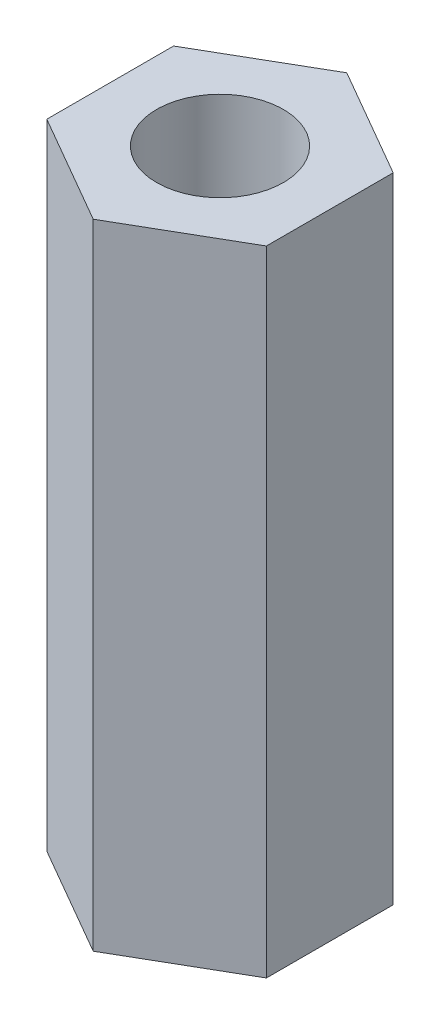
ISO-10303-21;
HEADER;
FILE_DESCRIPTION(('STEP AP214'),'2;1');
FILE_NAME('part.step','',(''),(''),'','','');
FILE_SCHEMA(('AUTOMOTIVE_DESIGN { 1 0 10303 214 1 1 1 1 }'));
ENDSEC;
DATA;
#1=APPLICATION_CONTEXT('core data for automotive mechanical design processes');
#2=APPLICATION_PROTOCOL_DEFINITION('international standard','automotive_design',2000,#1);
#3=PRODUCT_CONTEXT('',#1,'mechanical');
#4=PRODUCT('Part','Part','',(#3));
#5=PRODUCT_RELATED_PRODUCT_CATEGORY('part','',(#4));
#6=PRODUCT_DEFINITION_FORMATION('','',#4);
#7=PRODUCT_DEFINITION_CONTEXT('part definition',#1,'design');
#8=PRODUCT_DEFINITION('design','',#6,#7);
#9=PRODUCT_DEFINITION_SHAPE('','',#8);
#10=(LENGTH_UNIT() NAMED_UNIT(*) SI_UNIT(.MILLI.,.METRE.));
#11=(NAMED_UNIT(*) PLANE_ANGLE_UNIT() SI_UNIT($,.RADIAN.));
#12=(NAMED_UNIT(*) SI_UNIT($,.STERADIAN.) SOLID_ANGLE_UNIT());
#13=UNCERTAINTY_MEASURE_WITH_UNIT(LENGTH_MEASURE(1.E-05),#10,'distance_accuracy_value','');
#14=(GEOMETRIC_REPRESENTATION_CONTEXT(3) GLOBAL_UNCERTAINTY_ASSIGNED_CONTEXT((#13)) GLOBAL_UNIT_ASSIGNED_CONTEXT((#10,
#11,#12)) REPRESENTATION_CONTEXT('',''));
#15=CARTESIAN_POINT('',(0.,0.,0.));
#16=DIRECTION('',(0.,0.,1.));
#17=DIRECTION('',(1.,0.,0.));
#18=AXIS2_PLACEMENT_3D('',#15,#16,#17);
#19=CARTESIAN_POINT('',(0.,15.,0.));
#20=DIRECTION('',(0.,1.,0.));
#21=DIRECTION('',(0.,0.,1.));
#22=AXIS2_PLACEMENT_3D('',#19,#20,#21);
#23=PLANE('',#22);
#24=DIRECTION('',(-0.866025403784442,0.,-0.499999999999995));
#25=VECTOR('',#24,1.);
#26=CARTESIAN_POINT('',(2.5980762113533,15.,-1.50000000000003));
#27=LINE('',#26,#25);
#28=CARTESIAN_POINT('',(2.5980762113533,15.,-1.50000000000003));
#29=VERTEX_POINT('',#28);
#30=CARTESIAN_POINT('',(0.,15.,-3.));
#31=VERTEX_POINT('',#30);
#32=EDGE_CURVE('E134',#29,#31,#27,.T.);
#33=ORIENTED_EDGE('',*,*,#32,.T.);
#34=DIRECTION('',(-0.866025403784438,0.,0.500000000000001));
#35=VECTOR('',#34,1.);
#36=CARTESIAN_POINT('',(0.,15.,-3.));
#37=LINE('',#36,#35);
#38=CARTESIAN_POINT('',(-2.59807621135332,15.,-1.49999999999999));
#39=VERTEX_POINT('',#38);
#40=EDGE_CURVE('E92',#31,#39,#37,.T.);
#41=ORIENTED_EDGE('',*,*,#40,.T.);
#42=DIRECTION('',(0.,0.,1.));
#43=VECTOR('',#42,1.);
#44=CARTESIAN_POINT('',(-2.59807621135332,15.,-1.49999999999999));
#45=LINE('',#44,#43);
#46=CARTESIAN_POINT('',(-2.59807621135331,15.,1.50000000000001));
#47=VERTEX_POINT('',#46);
#48=EDGE_CURVE('E105',#39,#47,#45,.T.);
#49=ORIENTED_EDGE('',*,*,#48,.T.);
#50=DIRECTION('',(0.866025403784442,0.,0.499999999999995));
#51=VECTOR('',#50,1.);
#52=CARTESIAN_POINT('',(-2.59807621135331,15.,1.50000000000001));
#53=LINE('',#52,#51);
#54=CARTESIAN_POINT('',(0.,15.,3.));
#55=VERTEX_POINT('',#54);
#56=EDGE_CURVE('E99',#47,#55,#53,.T.);
#57=ORIENTED_EDGE('',*,*,#56,.T.);
#58=DIRECTION('',(0.866025403784434,0.,-0.500000000000007));
#59=VECTOR('',#58,1.);
#60=CARTESIAN_POINT('',(0.,15.,3.));
#61=LINE('',#60,#59);
#62=CARTESIAN_POINT('',(2.59807621135333,15.,1.49999999999998));
#63=VERTEX_POINT('',#62);
#64=EDGE_CURVE('E103',#55,#63,#61,.T.);
#65=ORIENTED_EDGE('',*,*,#64,.T.);
#66=DIRECTION('',(0.,0.,-1.));
#67=VECTOR('',#66,1.);
#68=CARTESIAN_POINT('',(2.59807621135333,15.,1.49999999999998));
#69=LINE('',#68,#67);
#70=EDGE_CURVE('E55',#63,#29,#69,.T.);
#71=ORIENTED_EDGE('',*,*,#70,.T.);
#72=EDGE_LOOP('',(#33,#41,#49,#57,#65,#71));
#73=FACE_BOUND('',#72,.T.);
#74=CARTESIAN_POINT('',(0.,15.,0.));
#75=DIRECTION('',(0.,1.,0.));
#76=DIRECTION('',(0.,0.,1.));
#77=AXIS2_PLACEMENT_3D('',#74,#75,#76);
#78=CIRCLE('',#77,1.5);
#79=CARTESIAN_POINT('',(0.,15.,1.5));
#80=VERTEX_POINT('',#79);
#81=EDGE_CURVE('E127',#80,#80,#78,.T.);
#82=ORIENTED_EDGE('',*,*,#81,.F.);
#83=EDGE_LOOP('',(#82));
#84=FACE_BOUND('',#83,.T.);
#85=ADVANCED_FACE('F38',(#73,#84),#23,.T.);
#86=CARTESIAN_POINT('',(0.,0.,0.));
#87=DIRECTION('',(0.,1.,0.));
#88=DIRECTION('',(0.,0.,1.));
#89=AXIS2_PLACEMENT_3D('',#86,#87,#88);
#90=PLANE('',#89);
#91=DIRECTION('',(-0.866025403784442,0.,-0.499999999999995));
#92=VECTOR('',#91,1.);
#93=CARTESIAN_POINT('',(2.5980762113533,0.,-1.50000000000003));
#94=LINE('',#93,#92);
#95=CARTESIAN_POINT('',(2.5980762113533,0.,-1.50000000000003));
#96=VERTEX_POINT('',#95);
#97=CARTESIAN_POINT('',(0.,0.,-3.));
#98=VERTEX_POINT('',#97);
#99=EDGE_CURVE('E123',#96,#98,#94,.T.);
#100=ORIENTED_EDGE('',*,*,#99,.F.);
#101=DIRECTION('',(0.,0.,-1.));
#102=VECTOR('',#101,1.);
#103=CARTESIAN_POINT('',(2.59807621135333,0.,1.49999999999998));
#104=LINE('',#103,#102);
#105=CARTESIAN_POINT('',(2.59807621135333,0.,1.49999999999998));
#106=VERTEX_POINT('',#105);
#107=EDGE_CURVE('E84',#106,#96,#104,.T.);
#108=ORIENTED_EDGE('',*,*,#107,.F.);
#109=DIRECTION('',(0.866025403784434,0.,-0.500000000000007));
#110=VECTOR('',#109,1.);
#111=CARTESIAN_POINT('',(0.,0.,3.));
#112=LINE('',#111,#110);
#113=CARTESIAN_POINT('',(0.,0.,3.));
#114=VERTEX_POINT('',#113);
#115=EDGE_CURVE('E78',#114,#106,#112,.T.);
#116=ORIENTED_EDGE('',*,*,#115,.F.);
#117=DIRECTION('',(0.866025403784442,0.,0.499999999999995));
#118=VECTOR('',#117,1.);
#119=CARTESIAN_POINT('',(-2.59807621135331,0.,1.50000000000001));
#120=LINE('',#119,#118);
#121=CARTESIAN_POINT('',(-2.59807621135331,0.,1.50000000000001));
#122=VERTEX_POINT('',#121);
#123=EDGE_CURVE('E113',#122,#114,#120,.T.);
#124=ORIENTED_EDGE('',*,*,#123,.F.);
#125=DIRECTION('',(0.,0.,1.));
#126=VECTOR('',#125,1.);
#127=CARTESIAN_POINT('',(-2.59807621135332,0.,-1.49999999999999));
#128=LINE('',#127,#126);
#129=CARTESIAN_POINT('',(-2.59807621135332,0.,-1.49999999999999));
#130=VERTEX_POINT('',#129);
#131=EDGE_CURVE('E129',#130,#122,#128,.T.);
#132=ORIENTED_EDGE('',*,*,#131,.F.);
#133=DIRECTION('',(-0.866025403784438,0.,0.500000000000001));
#134=VECTOR('',#133,1.);
#135=CARTESIAN_POINT('',(0.,0.,-3.));
#136=LINE('',#135,#134);
#137=EDGE_CURVE('E126',#98,#130,#136,.T.);
#138=ORIENTED_EDGE('',*,*,#137,.F.);
#139=EDGE_LOOP('',(#100,#108,#116,#124,#132,#138));
#140=FACE_BOUND('',#139,.T.);
#141=CARTESIAN_POINT('',(0.,0.,0.));
#142=DIRECTION('',(0.,1.,0.));
#143=DIRECTION('',(0.,0.,1.));
#144=AXIS2_PLACEMENT_3D('',#141,#142,#143);
#145=CIRCLE('',#144,1.5);
#146=CARTESIAN_POINT('',(0.,0.,1.5));
#147=VERTEX_POINT('',#146);
#148=EDGE_CURVE('E245',#147,#147,#145,.T.);
#149=ORIENTED_EDGE('',*,*,#148,.T.);
#150=EDGE_LOOP('',(#149));
#151=FACE_BOUND('',#150,.T.);
#152=ADVANCED_FACE('F143',(#140,#151),#90,.F.);
#153=CARTESIAN_POINT('',(2.5980762113533,15.,-1.50000000000003));
#154=DIRECTION('',(-0.499999999999995,0.,0.866025403784441));
#155=DIRECTION('',(0.866025403784441,0.,0.499999999999995));
#156=AXIS2_PLACEMENT_3D('',#153,#154,#155);
#157=PLANE('',#156);
#158=ORIENTED_EDGE('',*,*,#99,.T.);
#159=DIRECTION('',(0.,-1.,0.));
#160=VECTOR('',#159,1.);
#161=CARTESIAN_POINT('',(0.,15.,-3.));
#162=LINE('',#161,#160);
#163=EDGE_CURVE('E11',#31,#98,#162,.T.);
#164=ORIENTED_EDGE('',*,*,#163,.F.);
#165=ORIENTED_EDGE('',*,*,#32,.F.);
#166=DIRECTION('',(0.,-1.,0.));
#167=VECTOR('',#166,1.);
#168=CARTESIAN_POINT('',(2.5980762113533,15.,-1.50000000000003));
#169=LINE('',#168,#167);
#170=EDGE_CURVE('E119',#29,#96,#169,.T.);
#171=ORIENTED_EDGE('',*,*,#170,.T.);
#172=EDGE_LOOP('',(#158,#164,#165,#171));
#173=FACE_BOUND('',#172,.T.);
#174=ADVANCED_FACE('F40',(#173),#157,.F.);
#175=CARTESIAN_POINT('',(0.,15.,-3.));
#176=DIRECTION('',(0.500000000000001,0.,0.866025403784438));
#177=DIRECTION('',(0.866025403784438,0.,-0.500000000000001));
#178=AXIS2_PLACEMENT_3D('',#175,#176,#177);
#179=PLANE('',#178);
#180=ORIENTED_EDGE('',*,*,#137,.T.);
#181=DIRECTION('',(0.,-1.,0.));
#182=VECTOR('',#181,1.);
#183=CARTESIAN_POINT('',(-2.59807621135332,15.,-1.49999999999999));
#184=LINE('',#183,#182);
#185=EDGE_CURVE('E47',#39,#130,#184,.T.);
#186=ORIENTED_EDGE('',*,*,#185,.F.);
#187=ORIENTED_EDGE('',*,*,#40,.F.);
#188=ORIENTED_EDGE('',*,*,#163,.T.);
#189=EDGE_LOOP('',(#180,#186,#187,#188));
#190=FACE_BOUND('',#189,.T.);
#191=ADVANCED_FACE('F168',(#190),#179,.F.);
#192=CARTESIAN_POINT('',(-2.59807621135332,15.,-1.49999999999999));
#193=DIRECTION('',(1.,0.,0.));
#194=DIRECTION('',(0.,0.,-1.));
#195=AXIS2_PLACEMENT_3D('',#192,#193,#194);
#196=PLANE('',#195);
#197=ORIENTED_EDGE('',*,*,#131,.T.);
#198=DIRECTION('',(0.,-1.,0.));
#199=VECTOR('',#198,1.);
#200=CARTESIAN_POINT('',(-2.59807621135331,15.,1.50000000000001));
#201=LINE('',#200,#199);
#202=EDGE_CURVE('E114',#47,#122,#201,.T.);
#203=ORIENTED_EDGE('',*,*,#202,.F.);
#204=ORIENTED_EDGE('',*,*,#48,.F.);
#205=ORIENTED_EDGE('',*,*,#185,.T.);
#206=EDGE_LOOP('',(#197,#203,#204,#205));
#207=FACE_BOUND('',#206,.T.);
#208=ADVANCED_FACE('F140',(#207),#196,.F.);
#209=CARTESIAN_POINT('',(-2.59807621135331,15.,1.50000000000001));
#210=DIRECTION('',(0.499999999999995,0.,-0.866025403784442));
#211=DIRECTION('',(-0.866025403784442,0.,-0.499999999999995));
#212=AXIS2_PLACEMENT_3D('',#209,#210,#211);
#213=PLANE('',#212);
#214=ORIENTED_EDGE('',*,*,#123,.T.);
#215=DIRECTION('',(0.,-1.,0.));
#216=VECTOR('',#215,1.);
#217=CARTESIAN_POINT('',(0.,15.,3.));
#218=LINE('',#217,#216);
#219=EDGE_CURVE('E110',#55,#114,#218,.T.);
#220=ORIENTED_EDGE('',*,*,#219,.F.);
#221=ORIENTED_EDGE('',*,*,#56,.F.);
#222=ORIENTED_EDGE('',*,*,#202,.T.);
#223=EDGE_LOOP('',(#214,#220,#221,#222));
#224=FACE_BOUND('',#223,.T.);
#225=ADVANCED_FACE('F111',(#224),#213,.F.);
#226=CARTESIAN_POINT('',(0.,15.,3.));
#227=DIRECTION('',(-0.500000000000007,0.,-0.866025403784435));
#228=DIRECTION('',(-0.866025403784435,0.,0.500000000000007));
#229=AXIS2_PLACEMENT_3D('',#226,#227,#228);
#230=PLANE('',#229);
#231=ORIENTED_EDGE('',*,*,#115,.T.);
#232=DIRECTION('',(0.,-1.,0.));
#233=VECTOR('',#232,1.);
#234=CARTESIAN_POINT('',(2.59807621135333,15.,1.49999999999998));
#235=LINE('',#234,#233);
#236=EDGE_CURVE('E115',#63,#106,#235,.T.);
#237=ORIENTED_EDGE('',*,*,#236,.F.);
#238=ORIENTED_EDGE('',*,*,#64,.F.);
#239=ORIENTED_EDGE('',*,*,#219,.T.);
#240=EDGE_LOOP('',(#231,#237,#238,#239));
#241=FACE_BOUND('',#240,.T.);
#242=ADVANCED_FACE('F117',(#241),#230,.F.);
#243=CARTESIAN_POINT('',(2.59807621135333,15.,1.49999999999998));
#244=DIRECTION('',(-1.,0.,0.));
#245=DIRECTION('',(0.,0.,1.));
#246=AXIS2_PLACEMENT_3D('',#243,#244,#245);
#247=PLANE('',#246);
#248=ORIENTED_EDGE('',*,*,#107,.T.);
#249=ORIENTED_EDGE('',*,*,#170,.F.);
#250=ORIENTED_EDGE('',*,*,#70,.F.);
#251=ORIENTED_EDGE('',*,*,#236,.T.);
#252=EDGE_LOOP('',(#248,#249,#250,#251));
#253=FACE_BOUND('',#252,.T.);
#254=ADVANCED_FACE('F148',(#253),#247,.F.);
#255=CARTESIAN_POINT('',(0.,15.,0.));
#256=DIRECTION('',(0.,-1.,0.));
#257=DIRECTION('',(0.,0.,-1.));
#258=AXIS2_PLACEMENT_3D('',#255,#256,#257);
#259=CYLINDRICAL_SURFACE('',#258,1.5);
#260=ORIENTED_EDGE('',*,*,#81,.T.);
#261=EDGE_LOOP('',(#260));
#262=FACE_BOUND('',#261,.T.);
#263=ORIENTED_EDGE('',*,*,#148,.F.);
#264=EDGE_LOOP('',(#263));
#265=FACE_BOUND('',#264,.T.);
#266=ADVANCED_FACE('F150',(#262,#265),#259,.F.);
#267=CLOSED_SHELL('',(#85,#152,#174,#191,#208,#225,#242,#254,#266));
#268=MANIFOLD_SOLID_BREP('B2',#267);
#269=ADVANCED_BREP_SHAPE_REPRESENTATION('',(#18,#268),#14);
#270=SHAPE_DEFINITION_REPRESENTATION(#9,#269);
ENDSEC;
END-ISO-10303-21;
